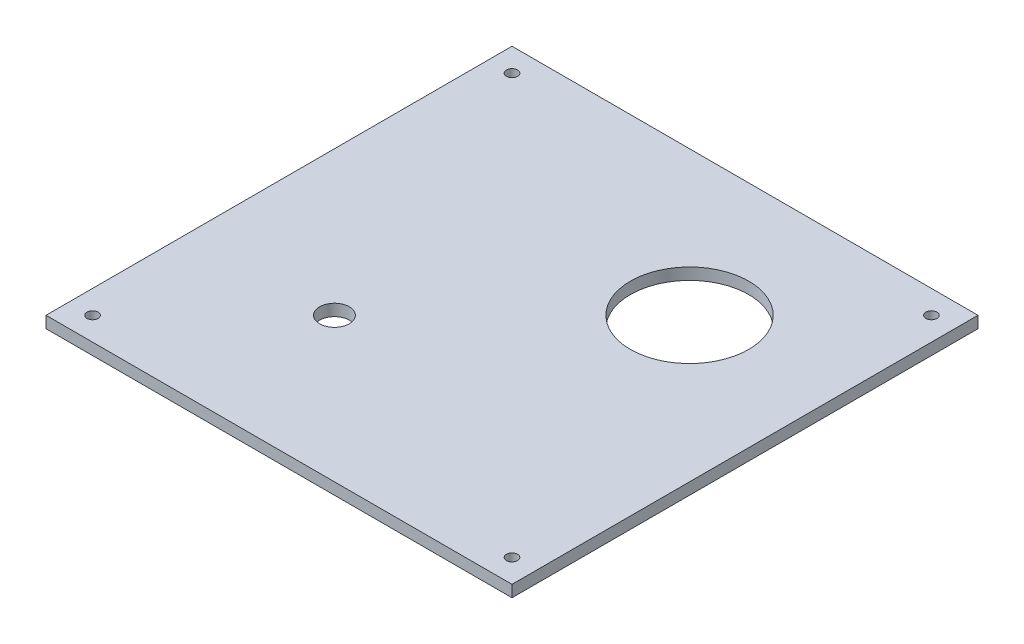
ISO-10303-21;
HEADER;
FILE_DESCRIPTION(('STEP AP214'),'2;1');
FILE_NAME('part.step','',(''),(''),'','','');
FILE_SCHEMA(('AUTOMOTIVE_DESIGN { 1 0 10303 214 1 1 1 1 }'));
ENDSEC;
DATA;
#1=APPLICATION_CONTEXT('core data for automotive mechanical design processes');
#2=APPLICATION_PROTOCOL_DEFINITION('international standard','automotive_design',2000,#1);
#3=PRODUCT_CONTEXT('',#1,'mechanical');
#4=PRODUCT('Part','Part','',(#3));
#5=PRODUCT_RELATED_PRODUCT_CATEGORY('part','',(#4));
#6=PRODUCT_DEFINITION_FORMATION('','',#4);
#7=PRODUCT_DEFINITION_CONTEXT('part definition',#1,'design');
#8=PRODUCT_DEFINITION('design','',#6,#7);
#9=PRODUCT_DEFINITION_SHAPE('','',#8);
#10=(LENGTH_UNIT() NAMED_UNIT(*) SI_UNIT(.MILLI.,.METRE.));
#11=(NAMED_UNIT(*) PLANE_ANGLE_UNIT() SI_UNIT($,.RADIAN.));
#12=(NAMED_UNIT(*) SI_UNIT($,.STERADIAN.) SOLID_ANGLE_UNIT());
#13=UNCERTAINTY_MEASURE_WITH_UNIT(LENGTH_MEASURE(1.E-05),#10,'distance_accuracy_value','');
#14=(GEOMETRIC_REPRESENTATION_CONTEXT(3) GLOBAL_UNCERTAINTY_ASSIGNED_CONTEXT((#13)) GLOBAL_UNIT_ASSIGNED_CONTEXT((#10,
#11,#12)) REPRESENTATION_CONTEXT('',''));
#15=CARTESIAN_POINT('',(0.,0.,0.));
#16=DIRECTION('',(0.,0.,1.));
#17=DIRECTION('',(1.,0.,0.));
#18=AXIS2_PLACEMENT_3D('',#15,#16,#17);
#19=CARTESIAN_POINT('',(-100.,2.5,100.));
#20=DIRECTION('',(1.,0.,0.));
#21=DIRECTION('',(0.,0.,-1.));
#22=AXIS2_PLACEMENT_3D('',#19,#20,#21);
#23=PLANE('',#22);
#24=DIRECTION('',(0.,0.,1.));
#25=VECTOR('',#24,1.);
#26=CARTESIAN_POINT('',(-100.,-2.5,100.));
#27=LINE('',#26,#25);
#28=CARTESIAN_POINT('',(-100.,-2.5,-100.));
#29=VERTEX_POINT('',#28);
#30=CARTESIAN_POINT('',(-100.,-2.5,100.));
#31=VERTEX_POINT('',#30);
#32=EDGE_CURVE('E100',#29,#31,#27,.T.);
#33=ORIENTED_EDGE('',*,*,#32,.T.);
#34=DIRECTION('',(0.,-1.,0.));
#35=VECTOR('',#34,1.);
#36=CARTESIAN_POINT('',(-100.,2.5,100.));
#37=LINE('',#36,#35);
#38=CARTESIAN_POINT('',(-100.,2.5,100.));
#39=VERTEX_POINT('',#38);
#40=EDGE_CURVE('E11',#39,#31,#37,.T.);
#41=ORIENTED_EDGE('',*,*,#40,.F.);
#42=DIRECTION('',(0.,0.,1.));
#43=VECTOR('',#42,1.);
#44=CARTESIAN_POINT('',(-100.,2.5,100.));
#45=LINE('',#44,#43);
#46=CARTESIAN_POINT('',(-100.,2.5,-100.));
#47=VERTEX_POINT('',#46);
#48=EDGE_CURVE('E88',#47,#39,#45,.T.);
#49=ORIENTED_EDGE('',*,*,#48,.F.);
#50=DIRECTION('',(0.,-1.,0.));
#51=VECTOR('',#50,1.);
#52=CARTESIAN_POINT('',(-100.,2.5,-100.));
#53=LINE('',#52,#51);
#54=EDGE_CURVE('E96',#47,#29,#53,.T.);
#55=ORIENTED_EDGE('',*,*,#54,.T.);
#56=EDGE_LOOP('',(#33,#41,#49,#55));
#57=FACE_BOUND('',#56,.T.);
#58=ADVANCED_FACE('F37',(#57),#23,.F.);
#59=CARTESIAN_POINT('',(100.,2.5,100.));
#60=DIRECTION('',(0.,0.,-1.));
#61=DIRECTION('',(-1.,0.,0.));
#62=AXIS2_PLACEMENT_3D('',#59,#60,#61);
#63=PLANE('',#62);
#64=DIRECTION('',(1.,0.,0.));
#65=VECTOR('',#64,1.);
#66=CARTESIAN_POINT('',(100.,-2.5,100.));
#67=LINE('',#66,#65);
#68=CARTESIAN_POINT('',(100.,-2.5,100.));
#69=VERTEX_POINT('',#68);
#70=EDGE_CURVE('E92',#31,#69,#67,.T.);
#71=ORIENTED_EDGE('',*,*,#70,.T.);
#72=DIRECTION('',(0.,-1.,0.));
#73=VECTOR('',#72,1.);
#74=CARTESIAN_POINT('',(100.,2.5,100.));
#75=LINE('',#74,#73);
#76=CARTESIAN_POINT('',(100.,2.5,100.));
#77=VERTEX_POINT('',#76);
#78=EDGE_CURVE('E45',#77,#69,#75,.T.);
#79=ORIENTED_EDGE('',*,*,#78,.F.);
#80=DIRECTION('',(1.,0.,0.));
#81=VECTOR('',#80,1.);
#82=CARTESIAN_POINT('',(100.,2.5,100.));
#83=LINE('',#82,#81);
#84=EDGE_CURVE('E83',#39,#77,#83,.T.);
#85=ORIENTED_EDGE('',*,*,#84,.F.);
#86=ORIENTED_EDGE('',*,*,#40,.T.);
#87=EDGE_LOOP('',(#71,#79,#85,#86));
#88=FACE_BOUND('',#87,.T.);
#89=ADVANCED_FACE('F91',(#88),#63,.F.);
#90=CARTESIAN_POINT('',(100.,2.5,100.));
#91=DIRECTION('',(-1.,0.,0.));
#92=DIRECTION('',(0.,0.,1.));
#93=AXIS2_PLACEMENT_3D('',#90,#91,#92);
#94=PLANE('',#93);
#95=DIRECTION('',(0.,0.,-1.));
#96=VECTOR('',#95,1.);
#97=CARTESIAN_POINT('',(100.,-2.5,100.));
#98=LINE('',#97,#96);
#99=CARTESIAN_POINT('',(100.,-2.5,-100.));
#100=VERTEX_POINT('',#99);
#101=EDGE_CURVE('E70',#69,#100,#98,.T.);
#102=ORIENTED_EDGE('',*,*,#101,.T.);
#103=DIRECTION('',(0.,-1.,0.));
#104=VECTOR('',#103,1.);
#105=CARTESIAN_POINT('',(100.,2.5,-100.));
#106=LINE('',#105,#104);
#107=CARTESIAN_POINT('',(100.,2.5,-100.));
#108=VERTEX_POINT('',#107);
#109=EDGE_CURVE('E93',#108,#100,#106,.T.);
#110=ORIENTED_EDGE('',*,*,#109,.F.);
#111=DIRECTION('',(0.,0.,-1.));
#112=VECTOR('',#111,1.);
#113=CARTESIAN_POINT('',(100.,2.5,100.));
#114=LINE('',#113,#112);
#115=EDGE_CURVE('E86',#77,#108,#114,.T.);
#116=ORIENTED_EDGE('',*,*,#115,.F.);
#117=ORIENTED_EDGE('',*,*,#78,.T.);
#118=EDGE_LOOP('',(#102,#110,#116,#117));
#119=FACE_BOUND('',#118,.T.);
#120=ADVANCED_FACE('F94',(#119),#94,.F.);
#121=CARTESIAN_POINT('',(100.,2.5,-100.));
#122=DIRECTION('',(0.,0.,1.));
#123=DIRECTION('',(1.,0.,0.));
#124=AXIS2_PLACEMENT_3D('',#121,#122,#123);
#125=PLANE('',#124);
#126=DIRECTION('',(-1.,0.,0.));
#127=VECTOR('',#126,1.);
#128=CARTESIAN_POINT('',(100.,-2.5,-100.));
#129=LINE('',#128,#127);
#130=EDGE_CURVE('E76',#100,#29,#129,.T.);
#131=ORIENTED_EDGE('',*,*,#130,.T.);
#132=ORIENTED_EDGE('',*,*,#54,.F.);
#133=DIRECTION('',(-1.,0.,0.));
#134=VECTOR('',#133,1.);
#135=CARTESIAN_POINT('',(100.,2.5,-100.));
#136=LINE('',#135,#134);
#137=EDGE_CURVE('E53',#108,#47,#136,.T.);
#138=ORIENTED_EDGE('',*,*,#137,.F.);
#139=ORIENTED_EDGE('',*,*,#109,.T.);
#140=EDGE_LOOP('',(#131,#132,#138,#139));
#141=FACE_BOUND('',#140,.T.);
#142=ADVANCED_FACE('F108',(#141),#125,.F.);
#143=CARTESIAN_POINT('',(0.,2.5,0.));
#144=DIRECTION('',(0.,1.,0.));
#145=DIRECTION('',(0.,0.,1.));
#146=AXIS2_PLACEMENT_3D('',#143,#144,#145);
#147=PLANE('',#146);
#148=CARTESIAN_POINT('',(38.1,2.5,-38.1));
#149=DIRECTION('',(0.,1.,0.));
#150=DIRECTION('',(0.,0.,1.));
#151=AXIS2_PLACEMENT_3D('',#148,#149,#150);
#152=CIRCLE('',#151,25.4);
#153=CARTESIAN_POINT('',(38.1,2.5,-12.7));
#154=VERTEX_POINT('',#153);
#155=EDGE_CURVE('E144',#154,#154,#152,.T.);
#156=ORIENTED_EDGE('',*,*,#155,.F.);
#157=EDGE_LOOP('',(#156));
#158=FACE_BOUND('',#157,.T.);
#159=CARTESIAN_POINT('',(-38.1,2.5,38.1));
#160=DIRECTION('',(0.,1.,0.));
#161=DIRECTION('',(0.,0.,1.));
#162=AXIS2_PLACEMENT_3D('',#159,#160,#161);
#163=CIRCLE('',#162,6.35);
#164=CARTESIAN_POINT('',(-38.1,2.5,44.45));
#165=VERTEX_POINT('',#164);
#166=EDGE_CURVE('E138',#165,#165,#163,.T.);
#167=ORIENTED_EDGE('',*,*,#166,.F.);
#168=EDGE_LOOP('',(#167));
#169=FACE_BOUND('',#168,.T.);
#170=CARTESIAN_POINT('',(90.,2.5,-90.));
#171=DIRECTION('',(0.,1.,0.));
#172=DIRECTION('',(0.,0.,1.));
#173=AXIS2_PLACEMENT_3D('',#170,#171,#172);
#174=CIRCLE('',#173,2.38125);
#175=CARTESIAN_POINT('',(90.,2.5,-87.61875));
#176=VERTEX_POINT('',#175);
#177=EDGE_CURVE('E117',#176,#176,#174,.T.);
#178=ORIENTED_EDGE('',*,*,#177,.F.);
#179=EDGE_LOOP('',(#178));
#180=FACE_BOUND('',#179,.T.);
#181=CARTESIAN_POINT('',(-90.,2.5,90.));
#182=DIRECTION('',(0.,1.,0.));
#183=DIRECTION('',(0.,0.,1.));
#184=AXIS2_PLACEMENT_3D('',#181,#182,#183);
#185=CIRCLE('',#184,2.38125);
#186=CARTESIAN_POINT('',(-90.,2.5,92.38125));
#187=VERTEX_POINT('',#186);
#188=EDGE_CURVE('E123',#187,#187,#185,.T.);
#189=ORIENTED_EDGE('',*,*,#188,.F.);
#190=EDGE_LOOP('',(#189));
#191=FACE_BOUND('',#190,.T.);
#192=CARTESIAN_POINT('',(90.,2.5,90.));
#193=DIRECTION('',(0.,1.,0.));
#194=DIRECTION('',(0.,0.,1.));
#195=AXIS2_PLACEMENT_3D('',#192,#193,#194);
#196=CIRCLE('',#195,2.38125);
#197=CARTESIAN_POINT('',(90.,2.5,92.38125));
#198=VERTEX_POINT('',#197);
#199=EDGE_CURVE('E124',#198,#198,#196,.T.);
#200=ORIENTED_EDGE('',*,*,#199,.F.);
#201=EDGE_LOOP('',(#200));
#202=FACE_BOUND('',#201,.T.);
#203=CARTESIAN_POINT('',(-90.,2.5,-90.));
#204=DIRECTION('',(0.,1.,0.));
#205=DIRECTION('',(0.,0.,1.));
#206=AXIS2_PLACEMENT_3D('',#203,#204,#205);
#207=CIRCLE('',#206,2.38125);
#208=CARTESIAN_POINT('',(-90.,2.5,-87.61875));
#209=VERTEX_POINT('',#208);
#210=EDGE_CURVE('E114',#209,#209,#207,.T.);
#211=ORIENTED_EDGE('',*,*,#210,.F.);
#212=EDGE_LOOP('',(#211));
#213=FACE_BOUND('',#212,.T.);
#214=ORIENTED_EDGE('',*,*,#48,.T.);
#215=ORIENTED_EDGE('',*,*,#84,.T.);
#216=ORIENTED_EDGE('',*,*,#115,.T.);
#217=ORIENTED_EDGE('',*,*,#137,.T.);
#218=EDGE_LOOP('',(#214,#215,#216,#217));
#219=FACE_BOUND('',#218,.T.);
#220=ADVANCED_FACE('F84',(#158,#169,#180,#191,#202,#213,#219),#147,.T.);
#221=CARTESIAN_POINT('',(0.,-2.5,0.));
#222=DIRECTION('',(0.,1.,0.));
#223=DIRECTION('',(0.,0.,1.));
#224=AXIS2_PLACEMENT_3D('',#221,#222,#223);
#225=PLANE('',#224);
#226=CARTESIAN_POINT('',(38.1,-2.5,-38.1));
#227=DIRECTION('',(0.,1.,0.));
#228=DIRECTION('',(0.,0.,1.));
#229=AXIS2_PLACEMENT_3D('',#226,#227,#228);
#230=CIRCLE('',#229,25.4);
#231=CARTESIAN_POINT('',(38.1,-2.5,-12.7));
#232=VERTEX_POINT('',#231);
#233=EDGE_CURVE('E141',#232,#232,#230,.T.);
#234=ORIENTED_EDGE('',*,*,#233,.T.);
#235=EDGE_LOOP('',(#234));
#236=FACE_BOUND('',#235,.T.);
#237=CARTESIAN_POINT('',(-38.1,-2.5,38.1));
#238=DIRECTION('',(0.,1.,0.));
#239=DIRECTION('',(0.,0.,1.));
#240=AXIS2_PLACEMENT_3D('',#237,#238,#239);
#241=CIRCLE('',#240,6.35);
#242=CARTESIAN_POINT('',(-38.1,-2.5,44.45));
#243=VERTEX_POINT('',#242);
#244=EDGE_CURVE('E135',#243,#243,#241,.T.);
#245=ORIENTED_EDGE('',*,*,#244,.T.);
#246=EDGE_LOOP('',(#245));
#247=FACE_BOUND('',#246,.T.);
#248=CARTESIAN_POINT('',(90.,-2.5,-90.));
#249=DIRECTION('',(0.,1.,0.));
#250=DIRECTION('',(0.,0.,1.));
#251=AXIS2_PLACEMENT_3D('',#248,#249,#250);
#252=CIRCLE('',#251,2.38125);
#253=CARTESIAN_POINT('',(90.,-2.5,-87.61875));
#254=VERTEX_POINT('',#253);
#255=EDGE_CURVE('E127',#254,#254,#252,.T.);
#256=ORIENTED_EDGE('',*,*,#255,.T.);
#257=EDGE_LOOP('',(#256));
#258=FACE_BOUND('',#257,.T.);
#259=CARTESIAN_POINT('',(-90.,-2.5,90.));
#260=DIRECTION('',(0.,1.,0.));
#261=DIRECTION('',(0.,0.,1.));
#262=AXIS2_PLACEMENT_3D('',#259,#260,#261);
#263=CIRCLE('',#262,2.38125);
#264=CARTESIAN_POINT('',(-90.,-2.5,92.38125));
#265=VERTEX_POINT('',#264);
#266=EDGE_CURVE('E120',#265,#265,#263,.T.);
#267=ORIENTED_EDGE('',*,*,#266,.T.);
#268=EDGE_LOOP('',(#267));
#269=FACE_BOUND('',#268,.T.);
#270=CARTESIAN_POINT('',(90.,-2.5,90.));
#271=DIRECTION('',(0.,1.,0.));
#272=DIRECTION('',(0.,0.,1.));
#273=AXIS2_PLACEMENT_3D('',#270,#271,#272);
#274=CIRCLE('',#273,2.38125);
#275=CARTESIAN_POINT('',(90.,-2.5,92.38125));
#276=VERTEX_POINT('',#275);
#277=EDGE_CURVE('E132',#276,#276,#274,.T.);
#278=ORIENTED_EDGE('',*,*,#277,.T.);
#279=EDGE_LOOP('',(#278));
#280=FACE_BOUND('',#279,.T.);
#281=CARTESIAN_POINT('',(-90.,-2.5,-90.));
#282=DIRECTION('',(0.,1.,0.));
#283=DIRECTION('',(0.,0.,1.));
#284=AXIS2_PLACEMENT_3D('',#281,#282,#283);
#285=CIRCLE('',#284,2.38125);
#286=CARTESIAN_POINT('',(-90.,-2.5,-87.61875));
#287=VERTEX_POINT('',#286);
#288=EDGE_CURVE('E103',#287,#287,#285,.T.);
#289=ORIENTED_EDGE('',*,*,#288,.T.);
#290=EDGE_LOOP('',(#289));
#291=FACE_BOUND('',#290,.T.);
#292=ORIENTED_EDGE('',*,*,#32,.F.);
#293=ORIENTED_EDGE('',*,*,#130,.F.);
#294=ORIENTED_EDGE('',*,*,#101,.F.);
#295=ORIENTED_EDGE('',*,*,#70,.F.);
#296=EDGE_LOOP('',(#292,#293,#294,#295));
#297=FACE_BOUND('',#296,.T.);
#298=ADVANCED_FACE('F111',(#236,#247,#258,#269,#280,#291,#297),#225,.F.);
#299=CARTESIAN_POINT('',(-90.,-2.5,-90.));
#300=DIRECTION('',(0.,1.,0.));
#301=DIRECTION('',(0.,0.,1.));
#302=AXIS2_PLACEMENT_3D('',#299,#300,#301);
#303=CYLINDRICAL_SURFACE('',#302,2.38125);
#304=ORIENTED_EDGE('',*,*,#288,.F.);
#305=EDGE_LOOP('',(#304));
#306=FACE_BOUND('',#305,.T.);
#307=ORIENTED_EDGE('',*,*,#210,.T.);
#308=EDGE_LOOP('',(#307));
#309=FACE_BOUND('',#308,.T.);
#310=ADVANCED_FACE('F172',(#306,#309),#303,.F.);
#311=CARTESIAN_POINT('',(90.,-2.5,90.));
#312=DIRECTION('',(0.,1.,0.));
#313=DIRECTION('',(0.,0.,1.));
#314=AXIS2_PLACEMENT_3D('',#311,#312,#313);
#315=CYLINDRICAL_SURFACE('',#314,2.38125);
#316=ORIENTED_EDGE('',*,*,#277,.F.);
#317=EDGE_LOOP('',(#316));
#318=FACE_BOUND('',#317,.T.);
#319=ORIENTED_EDGE('',*,*,#199,.T.);
#320=EDGE_LOOP('',(#319));
#321=FACE_BOUND('',#320,.T.);
#322=ADVANCED_FACE('F174',(#318,#321),#315,.F.);
#323=CARTESIAN_POINT('',(-90.,-2.5,90.));
#324=DIRECTION('',(0.,1.,0.));
#325=DIRECTION('',(0.,0.,1.));
#326=AXIS2_PLACEMENT_3D('',#323,#324,#325);
#327=CYLINDRICAL_SURFACE('',#326,2.38125);
#328=ORIENTED_EDGE('',*,*,#266,.F.);
#329=EDGE_LOOP('',(#328));
#330=FACE_BOUND('',#329,.T.);
#331=ORIENTED_EDGE('',*,*,#188,.T.);
#332=EDGE_LOOP('',(#331));
#333=FACE_BOUND('',#332,.T.);
#334=ADVANCED_FACE('F181',(#330,#333),#327,.F.);
#335=CARTESIAN_POINT('',(90.,-2.5,-90.));
#336=DIRECTION('',(0.,1.,0.));
#337=DIRECTION('',(0.,0.,1.));
#338=AXIS2_PLACEMENT_3D('',#335,#336,#337);
#339=CYLINDRICAL_SURFACE('',#338,2.38125);
#340=ORIENTED_EDGE('',*,*,#255,.F.);
#341=EDGE_LOOP('',(#340));
#342=FACE_BOUND('',#341,.T.);
#343=ORIENTED_EDGE('',*,*,#177,.T.);
#344=EDGE_LOOP('',(#343));
#345=FACE_BOUND('',#344,.T.);
#346=ADVANCED_FACE('F230',(#342,#345),#339,.F.);
#347=CARTESIAN_POINT('',(-38.1,-2.5,38.1));
#348=DIRECTION('',(0.,1.,0.));
#349=DIRECTION('',(0.,0.,1.));
#350=AXIS2_PLACEMENT_3D('',#347,#348,#349);
#351=CYLINDRICAL_SURFACE('',#350,6.35);
#352=ORIENTED_EDGE('',*,*,#244,.F.);
#353=EDGE_LOOP('',(#352));
#354=FACE_BOUND('',#353,.T.);
#355=ORIENTED_EDGE('',*,*,#166,.T.);
#356=EDGE_LOOP('',(#355));
#357=FACE_BOUND('',#356,.T.);
#358=ADVANCED_FACE('F155',(#354,#357),#351,.F.);
#359=CARTESIAN_POINT('',(38.1,-2.5,-38.1));
#360=DIRECTION('',(0.,1.,0.));
#361=DIRECTION('',(0.,0.,1.));
#362=AXIS2_PLACEMENT_3D('',#359,#360,#361);
#363=CYLINDRICAL_SURFACE('',#362,25.4);
#364=ORIENTED_EDGE('',*,*,#233,.F.);
#365=EDGE_LOOP('',(#364));
#366=FACE_BOUND('',#365,.T.);
#367=ORIENTED_EDGE('',*,*,#155,.T.);
#368=EDGE_LOOP('',(#367));
#369=FACE_BOUND('',#368,.T.);
#370=ADVANCED_FACE('F152',(#366,#369),#363,.F.);
#371=CLOSED_SHELL('',(#58,#89,#120,#142,#220,#298,#310,#322,#334,#346,#358,#370));
#372=MANIFOLD_SOLID_BREP('B2',#371);
#373=ADVANCED_BREP_SHAPE_REPRESENTATION('',(#18,#372),#14);
#374=SHAPE_DEFINITION_REPRESENTATION(#9,#373);
ENDSEC;
END-ISO-10303-21;
